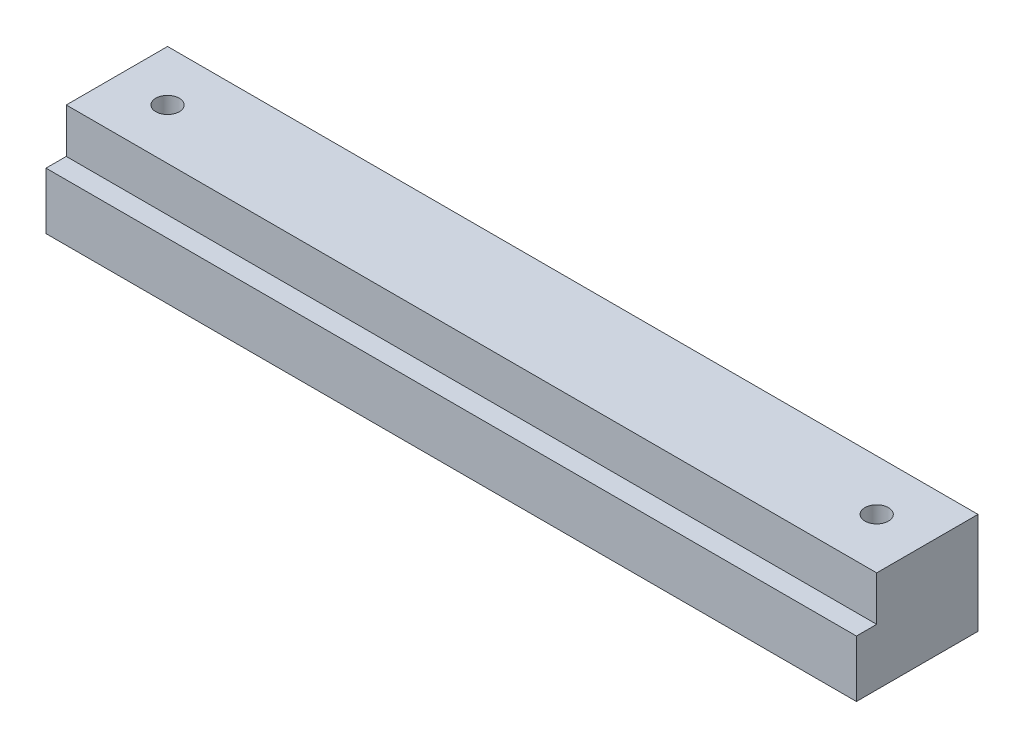
ISO-10303-21;
HEADER;
FILE_DESCRIPTION(('STEP AP214'),'2;1');
FILE_NAME('part.step','',(''),(''),'','','');
FILE_SCHEMA(('AUTOMOTIVE_DESIGN { 1 0 10303 214 1 1 1 1 }'));
ENDSEC;
DATA;
#1=APPLICATION_CONTEXT('core data for automotive mechanical design processes');
#2=APPLICATION_PROTOCOL_DEFINITION('international standard','automotive_design',2000,#1);
#3=PRODUCT_CONTEXT('',#1,'mechanical');
#4=PRODUCT('Part','Part','',(#3));
#5=PRODUCT_RELATED_PRODUCT_CATEGORY('part','',(#4));
#6=PRODUCT_DEFINITION_FORMATION('','',#4);
#7=PRODUCT_DEFINITION_CONTEXT('part definition',#1,'design');
#8=PRODUCT_DEFINITION('design','',#6,#7);
#9=PRODUCT_DEFINITION_SHAPE('','',#8);
#10=(LENGTH_UNIT() NAMED_UNIT(*) SI_UNIT(.MILLI.,.METRE.));
#11=(NAMED_UNIT(*) PLANE_ANGLE_UNIT() SI_UNIT($,.RADIAN.));
#12=(NAMED_UNIT(*) SI_UNIT($,.STERADIAN.) SOLID_ANGLE_UNIT());
#13=UNCERTAINTY_MEASURE_WITH_UNIT(LENGTH_MEASURE(1.E-05),#10,'distance_accuracy_value','');
#14=(GEOMETRIC_REPRESENTATION_CONTEXT(3) GLOBAL_UNCERTAINTY_ASSIGNED_CONTEXT((#13)) GLOBAL_UNIT_ASSIGNED_CONTEXT((#10,
#11,#12)) REPRESENTATION_CONTEXT('',''));
#15=CARTESIAN_POINT('',(0.,0.,0.));
#16=DIRECTION('',(0.,0.,1.));
#17=DIRECTION('',(1.,0.,0.));
#18=AXIS2_PLACEMENT_3D('',#15,#16,#17);
#19=CARTESIAN_POINT('',(0.,12.7,0.));
#20=DIRECTION('',(0.,0.,-1.));
#21=DIRECTION('',(-1.,0.,0.));
#22=AXIS2_PLACEMENT_3D('',#19,#20,#21);
#23=PLANE('',#22);
#24=DIRECTION('',(-1.,0.,0.));
#25=VECTOR('',#24,1.);
#26=CARTESIAN_POINT('',(0.,7.112,0.));
#27=LINE('',#26,#25);
#28=CARTESIAN_POINT('',(101.6,7.112,0.));
#29=VERTEX_POINT('',#28);
#30=CARTESIAN_POINT('',(0.,7.112,0.));
#31=VERTEX_POINT('',#30);
#32=EDGE_CURVE('E46',#29,#31,#27,.T.);
#33=ORIENTED_EDGE('',*,*,#32,.F.);
#34=DIRECTION('',(0.,-1.,0.));
#35=VECTOR('',#34,1.);
#36=CARTESIAN_POINT('',(101.6,12.7,0.));
#37=LINE('',#36,#35);
#38=CARTESIAN_POINT('',(101.6,12.7,0.));
#39=VERTEX_POINT('',#38);
#40=EDGE_CURVE('E40',#39,#29,#37,.T.);
#41=ORIENTED_EDGE('',*,*,#40,.F.);
#42=DIRECTION('',(1.,0.,0.));
#43=VECTOR('',#42,1.);
#44=CARTESIAN_POINT('',(0.,12.7,0.));
#45=LINE('',#44,#43);
#46=CARTESIAN_POINT('',(0.,12.7,0.));
#47=VERTEX_POINT('',#46);
#48=EDGE_CURVE('E75',#47,#39,#45,.T.);
#49=ORIENTED_EDGE('',*,*,#48,.F.);
#50=DIRECTION('',(0.,-1.,0.));
#51=VECTOR('',#50,1.);
#52=CARTESIAN_POINT('',(0.,12.7,0.));
#53=LINE('',#52,#51);
#54=EDGE_CURVE('E11',#47,#31,#53,.T.);
#55=ORIENTED_EDGE('',*,*,#54,.T.);
#56=EDGE_LOOP('',(#33,#41,#49,#55));
#57=FACE_BOUND('',#56,.T.);
#58=ADVANCED_FACE('F32',(#57),#23,.F.);
#59=CARTESIAN_POINT('',(0.,12.7,0.));
#60=DIRECTION('',(1.,0.,0.));
#61=DIRECTION('',(0.,0.,-1.));
#62=AXIS2_PLACEMENT_3D('',#59,#60,#61);
#63=PLANE('',#62);
#64=DIRECTION('',(0.,0.,1.));
#65=VECTOR('',#64,1.);
#66=CARTESIAN_POINT('',(0.,0.,0.));
#67=LINE('',#66,#65);
#68=CARTESIAN_POINT('',(0.,0.,-12.7));
#69=VERTEX_POINT('',#68);
#70=CARTESIAN_POINT('',(0.,0.,2.54));
#71=VERTEX_POINT('',#70);
#72=EDGE_CURVE('E92',#69,#71,#67,.T.);
#73=ORIENTED_EDGE('',*,*,#72,.T.);
#74=DIRECTION('',(0.,-1.,0.));
#75=VECTOR('',#74,1.);
#76=CARTESIAN_POINT('',(0.,0.,2.54));
#77=LINE('',#76,#75);
#78=CARTESIAN_POINT('',(0.,7.112,2.54));
#79=VERTEX_POINT('',#78);
#80=EDGE_CURVE('E96',#79,#71,#77,.T.);
#81=ORIENTED_EDGE('',*,*,#80,.F.);
#82=DIRECTION('',(0.,0.,-1.));
#83=VECTOR('',#82,1.);
#84=CARTESIAN_POINT('',(0.,7.112,2.54));
#85=LINE('',#84,#83);
#86=EDGE_CURVE('E118',#79,#31,#85,.T.);
#87=ORIENTED_EDGE('',*,*,#86,.T.);
#88=ORIENTED_EDGE('',*,*,#54,.F.);
#89=DIRECTION('',(0.,0.,1.));
#90=VECTOR('',#89,1.);
#91=CARTESIAN_POINT('',(0.,12.7,0.));
#92=LINE('',#91,#90);
#93=CARTESIAN_POINT('',(0.,12.7,-12.7));
#94=VERTEX_POINT('',#93);
#95=EDGE_CURVE('E135',#94,#47,#92,.T.);
#96=ORIENTED_EDGE('',*,*,#95,.F.);
#97=DIRECTION('',(0.,-1.,0.));
#98=VECTOR('',#97,1.);
#99=CARTESIAN_POINT('',(0.,12.7,-12.7));
#100=LINE('',#99,#98);
#101=EDGE_CURVE('E98',#94,#69,#100,.T.);
#102=ORIENTED_EDGE('',*,*,#101,.T.);
#103=EDGE_LOOP('',(#73,#81,#87,#88,#96,#102));
#104=FACE_BOUND('',#103,.T.);
#105=ADVANCED_FACE('F34',(#104),#63,.F.);
#106=CARTESIAN_POINT('',(101.6,12.7,0.));
#107=DIRECTION('',(-1.,0.,0.));
#108=DIRECTION('',(0.,0.,1.));
#109=AXIS2_PLACEMENT_3D('',#106,#107,#108);
#110=PLANE('',#109);
#111=DIRECTION('',(0.,0.,-1.));
#112=VECTOR('',#111,1.);
#113=CARTESIAN_POINT('',(101.6,0.,0.));
#114=LINE('',#113,#112);
#115=CARTESIAN_POINT('',(101.6,0.,2.54));
#116=VERTEX_POINT('',#115);
#117=CARTESIAN_POINT('',(101.6,0.,-12.7));
#118=VERTEX_POINT('',#117);
#119=EDGE_CURVE('E100',#116,#118,#114,.T.);
#120=ORIENTED_EDGE('',*,*,#119,.T.);
#121=DIRECTION('',(0.,-1.,0.));
#122=VECTOR('',#121,1.);
#123=CARTESIAN_POINT('',(101.6,12.7,-12.7));
#124=LINE('',#123,#122);
#125=CARTESIAN_POINT('',(101.6,12.7,-12.7));
#126=VERTEX_POINT('',#125);
#127=EDGE_CURVE('E144',#126,#118,#124,.T.);
#128=ORIENTED_EDGE('',*,*,#127,.F.);
#129=DIRECTION('',(0.,0.,-1.));
#130=VECTOR('',#129,1.);
#131=CARTESIAN_POINT('',(101.6,12.7,0.));
#132=LINE('',#131,#130);
#133=EDGE_CURVE('E138',#39,#126,#132,.T.);
#134=ORIENTED_EDGE('',*,*,#133,.F.);
#135=ORIENTED_EDGE('',*,*,#40,.T.);
#136=DIRECTION('',(0.,0.,-1.));
#137=VECTOR('',#136,1.);
#138=CARTESIAN_POINT('',(101.6,7.112,2.54));
#139=LINE('',#138,#137);
#140=CARTESIAN_POINT('',(101.6,7.112,2.54));
#141=VERTEX_POINT('',#140);
#142=EDGE_CURVE('E121',#141,#29,#139,.T.);
#143=ORIENTED_EDGE('',*,*,#142,.F.);
#144=DIRECTION('',(0.,1.,0.));
#145=VECTOR('',#144,1.);
#146=CARTESIAN_POINT('',(101.6,0.,2.54));
#147=LINE('',#146,#145);
#148=EDGE_CURVE('E108',#116,#141,#147,.T.);
#149=ORIENTED_EDGE('',*,*,#148,.F.);
#150=EDGE_LOOP('',(#120,#128,#134,#135,#143,#149));
#151=FACE_BOUND('',#150,.T.);
#152=ADVANCED_FACE('F148',(#151),#110,.F.);
#153=CARTESIAN_POINT('',(0.,12.7,-12.7));
#154=DIRECTION('',(0.,0.,1.));
#155=DIRECTION('',(1.,0.,0.));
#156=AXIS2_PLACEMENT_3D('',#153,#154,#155);
#157=PLANE('',#156);
#158=DIRECTION('',(-1.,0.,0.));
#159=VECTOR('',#158,1.);
#160=CARTESIAN_POINT('',(0.,0.,-12.7));
#161=LINE('',#160,#159);
#162=EDGE_CURVE('E70',#118,#69,#161,.T.);
#163=ORIENTED_EDGE('',*,*,#162,.T.);
#164=ORIENTED_EDGE('',*,*,#101,.F.);
#165=DIRECTION('',(-1.,0.,0.));
#166=VECTOR('',#165,1.);
#167=CARTESIAN_POINT('',(0.,12.7,-12.7));
#168=LINE('',#167,#166);
#169=EDGE_CURVE('E55',#126,#94,#168,.T.);
#170=ORIENTED_EDGE('',*,*,#169,.F.);
#171=ORIENTED_EDGE('',*,*,#127,.T.);
#172=EDGE_LOOP('',(#163,#164,#170,#171));
#173=FACE_BOUND('',#172,.T.);
#174=ADVANCED_FACE('F160',(#173),#157,.F.);
#175=CARTESIAN_POINT('',(0.,12.7,0.));
#176=DIRECTION('',(0.,-1.,0.));
#177=DIRECTION('',(0.,0.,-1.));
#178=AXIS2_PLACEMENT_3D('',#175,#176,#177);
#179=PLANE('',#178);
#180=CARTESIAN_POINT('',(6.35,12.7,-6.35));
#181=DIRECTION('',(0.,1.,0.));
#182=DIRECTION('',(0.,0.,1.));
#183=AXIS2_PLACEMENT_3D('',#180,#181,#182);
#184=CIRCLE('',#183,1.47319999999999);
#185=CARTESIAN_POINT('',(6.35,12.7,-4.87680000000001));
#186=VERTEX_POINT('',#185);
#187=EDGE_CURVE('E124',#186,#186,#184,.T.);
#188=ORIENTED_EDGE('',*,*,#187,.F.);
#189=EDGE_LOOP('',(#188));
#190=FACE_BOUND('',#189,.T.);
#191=CARTESIAN_POINT('',(95.25,12.7,-6.35));
#192=DIRECTION('',(0.,1.,0.));
#193=DIRECTION('',(0.,0.,1.));
#194=AXIS2_PLACEMENT_3D('',#191,#192,#193);
#195=CIRCLE('',#194,1.47319999999998);
#196=CARTESIAN_POINT('',(95.25,12.7,-4.87680000000002));
#197=VERTEX_POINT('',#196);
#198=EDGE_CURVE('E130',#197,#197,#195,.T.);
#199=ORIENTED_EDGE('',*,*,#198,.F.);
#200=EDGE_LOOP('',(#199));
#201=FACE_BOUND('',#200,.T.);
#202=ORIENTED_EDGE('',*,*,#95,.T.);
#203=ORIENTED_EDGE('',*,*,#48,.T.);
#204=ORIENTED_EDGE('',*,*,#133,.T.);
#205=ORIENTED_EDGE('',*,*,#169,.T.);
#206=EDGE_LOOP('',(#202,#203,#204,#205));
#207=FACE_BOUND('',#206,.T.);
#208=ADVANCED_FACE('F163',(#190,#201,#207),#179,.F.);
#209=CARTESIAN_POINT('',(0.,0.,0.));
#210=DIRECTION('',(0.,-1.,0.));
#211=DIRECTION('',(0.,0.,-1.));
#212=AXIS2_PLACEMENT_3D('',#209,#210,#211);
#213=PLANE('',#212);
#214=CARTESIAN_POINT('',(6.35,0.,-6.35));
#215=DIRECTION('',(0.,1.,0.));
#216=DIRECTION('',(0.,0.,1.));
#217=AXIS2_PLACEMENT_3D('',#214,#215,#216);
#218=CIRCLE('',#217,1.4732);
#219=CARTESIAN_POINT('',(6.35,0.,-4.8768));
#220=VERTEX_POINT('',#219);
#221=EDGE_CURVE('E127',#220,#220,#218,.T.);
#222=ORIENTED_EDGE('',*,*,#221,.T.);
#223=EDGE_LOOP('',(#222));
#224=FACE_BOUND('',#223,.T.);
#225=CARTESIAN_POINT('',(95.25,0.,-6.35));
#226=DIRECTION('',(0.,1.,0.));
#227=DIRECTION('',(0.,0.,1.));
#228=AXIS2_PLACEMENT_3D('',#225,#226,#227);
#229=CIRCLE('',#228,1.47319999999999);
#230=CARTESIAN_POINT('',(95.25,0.,-4.87680000000001));
#231=VERTEX_POINT('',#230);
#232=EDGE_CURVE('E101',#231,#231,#229,.T.);
#233=ORIENTED_EDGE('',*,*,#232,.T.);
#234=EDGE_LOOP('',(#233));
#235=FACE_BOUND('',#234,.T.);
#236=ORIENTED_EDGE('',*,*,#72,.F.);
#237=ORIENTED_EDGE('',*,*,#162,.F.);
#238=ORIENTED_EDGE('',*,*,#119,.F.);
#239=DIRECTION('',(1.,0.,0.));
#240=VECTOR('',#239,1.);
#241=CARTESIAN_POINT('',(0.,0.,2.54));
#242=LINE('',#241,#240);
#243=EDGE_CURVE('E104',#71,#116,#242,.T.);
#244=ORIENTED_EDGE('',*,*,#243,.F.);
#245=EDGE_LOOP('',(#236,#237,#238,#244));
#246=FACE_BOUND('',#245,.T.);
#247=ADVANCED_FACE('F105',(#224,#235,#246),#213,.T.);
#248=CARTESIAN_POINT('',(95.25,12.7,-6.35));
#249=DIRECTION('',(0.,1.,0.));
#250=DIRECTION('',(0.,0.,1.));
#251=AXIS2_PLACEMENT_3D('',#248,#249,#250);
#252=CYLINDRICAL_SURFACE('',#251,1.47319999999999);
#253=ORIENTED_EDGE('',*,*,#232,.F.);
#254=EDGE_LOOP('',(#253));
#255=FACE_BOUND('',#254,.T.);
#256=ORIENTED_EDGE('',*,*,#198,.T.);
#257=EDGE_LOOP('',(#256));
#258=FACE_BOUND('',#257,.T.);
#259=ADVANCED_FACE('F166',(#255,#258),#252,.F.);
#260=CARTESIAN_POINT('',(6.35,12.7,-6.35));
#261=DIRECTION('',(0.,1.,0.));
#262=DIRECTION('',(0.,0.,1.));
#263=AXIS2_PLACEMENT_3D('',#260,#261,#262);
#264=CYLINDRICAL_SURFACE('',#263,1.47319999999999);
#265=ORIENTED_EDGE('',*,*,#221,.F.);
#266=EDGE_LOOP('',(#265));
#267=FACE_BOUND('',#266,.T.);
#268=ORIENTED_EDGE('',*,*,#187,.T.);
#269=EDGE_LOOP('',(#268));
#270=FACE_BOUND('',#269,.T.);
#271=ADVANCED_FACE('F173',(#267,#270),#264,.F.);
#272=CARTESIAN_POINT('',(0.,7.112,2.54));
#273=DIRECTION('',(0.,-1.,0.));
#274=DIRECTION('',(0.,0.,-1.));
#275=AXIS2_PLACEMENT_3D('',#272,#273,#274);
#276=PLANE('',#275);
#277=ORIENTED_EDGE('',*,*,#32,.T.);
#278=ORIENTED_EDGE('',*,*,#86,.F.);
#279=DIRECTION('',(-1.,0.,0.));
#280=VECTOR('',#279,1.);
#281=CARTESIAN_POINT('',(0.,7.112,2.54));
#282=LINE('',#281,#280);
#283=EDGE_CURVE('E112',#141,#79,#282,.T.);
#284=ORIENTED_EDGE('',*,*,#283,.F.);
#285=ORIENTED_EDGE('',*,*,#142,.T.);
#286=EDGE_LOOP('',(#277,#278,#284,#285));
#287=FACE_BOUND('',#286,.T.);
#288=ADVANCED_FACE('F151',(#287),#276,.F.);
#289=CARTESIAN_POINT('',(0.,0.,2.54));
#290=DIRECTION('',(0.,0.,-1.));
#291=DIRECTION('',(-1.,0.,0.));
#292=AXIS2_PLACEMENT_3D('',#289,#290,#291);
#293=PLANE('',#292);
#294=ORIENTED_EDGE('',*,*,#80,.T.);
#295=ORIENTED_EDGE('',*,*,#243,.T.);
#296=ORIENTED_EDGE('',*,*,#148,.T.);
#297=ORIENTED_EDGE('',*,*,#283,.T.);
#298=EDGE_LOOP('',(#294,#295,#296,#297));
#299=FACE_BOUND('',#298,.T.);
#300=ADVANCED_FACE('F110',(#299),#293,.F.);
#301=CLOSED_SHELL('',(#58,#105,#152,#174,#208,#247,#259,#271,#288,#300));
#302=MANIFOLD_SOLID_BREP('B2',#301);
#303=ADVANCED_BREP_SHAPE_REPRESENTATION('',(#18,#302),#14);
#304=SHAPE_DEFINITION_REPRESENTATION(#9,#303);
ENDSEC;
END-ISO-10303-21;
